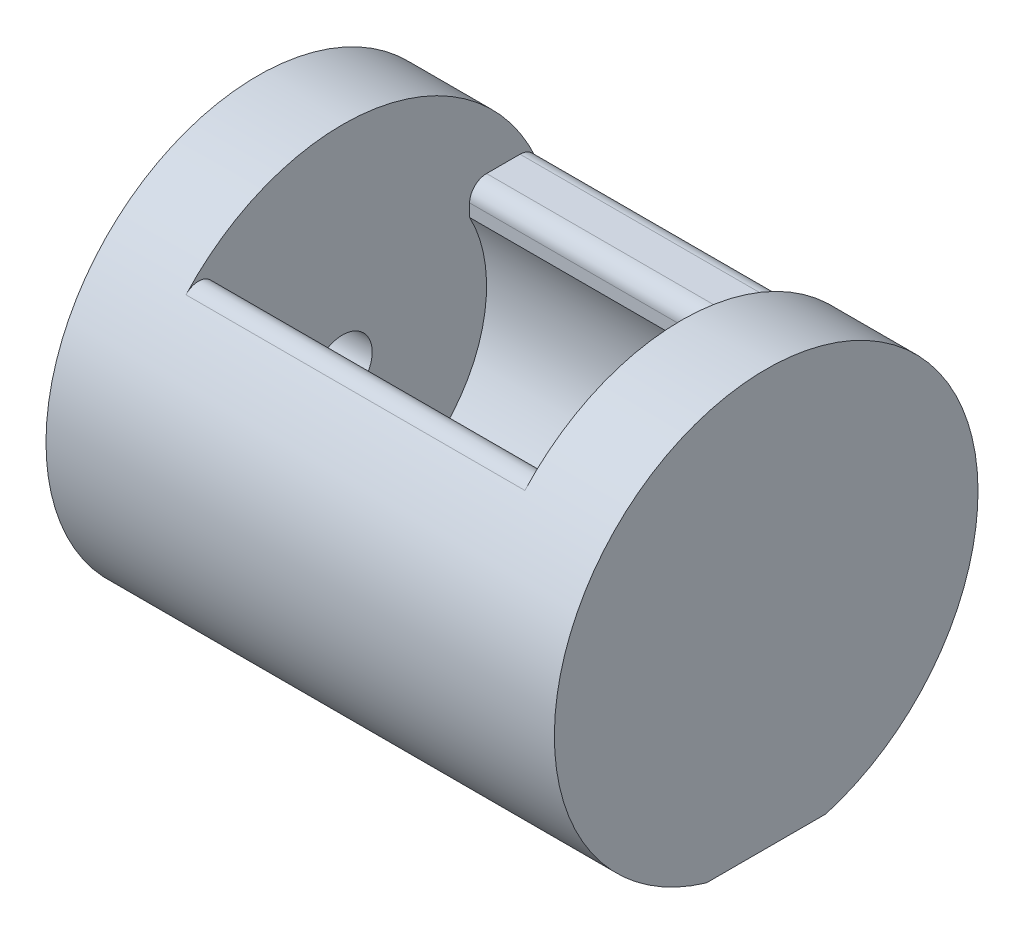
ISO-10303-21;
HEADER;
FILE_DESCRIPTION(('STEP AP214'),'2;1');
FILE_NAME('part.step','',(''),(''),'','','');
FILE_SCHEMA(('AUTOMOTIVE_DESIGN { 1 0 10303 214 1 1 1 1 }'));
ENDSEC;
DATA;
#1=APPLICATION_CONTEXT('core data for automotive mechanical design processes');
#2=APPLICATION_PROTOCOL_DEFINITION('international standard','automotive_design',2000,#1);
#3=PRODUCT_CONTEXT('',#1,'mechanical');
#4=PRODUCT('Part','Part','',(#3));
#5=PRODUCT_RELATED_PRODUCT_CATEGORY('part','',(#4));
#6=PRODUCT_DEFINITION_FORMATION('','',#4);
#7=PRODUCT_DEFINITION_CONTEXT('part definition',#1,'design');
#8=PRODUCT_DEFINITION('design','',#6,#7);
#9=PRODUCT_DEFINITION_SHAPE('','',#8);
#10=(LENGTH_UNIT() NAMED_UNIT(*) SI_UNIT(.MILLI.,.METRE.));
#11=(NAMED_UNIT(*) PLANE_ANGLE_UNIT() SI_UNIT($,.RADIAN.));
#12=(NAMED_UNIT(*) SI_UNIT($,.STERADIAN.) SOLID_ANGLE_UNIT());
#13=UNCERTAINTY_MEASURE_WITH_UNIT(LENGTH_MEASURE(1.E-05),#10,'distance_accuracy_value','');
#14=(GEOMETRIC_REPRESENTATION_CONTEXT(3) GLOBAL_UNCERTAINTY_ASSIGNED_CONTEXT((#13)) GLOBAL_UNIT_ASSIGNED_CONTEXT((#10,
#11,#12)) REPRESENTATION_CONTEXT('',''));
#15=CARTESIAN_POINT('',(0.,0.,0.));
#16=DIRECTION('',(0.,0.,1.));
#17=DIRECTION('',(1.,0.,0.));
#18=AXIS2_PLACEMENT_3D('',#15,#16,#17);
#19=CARTESIAN_POINT('',(20.,0.,0.));
#20=DIRECTION('',(-1.,0.,0.));
#21=DIRECTION('',(0.,0.,1.));
#22=AXIS2_PLACEMENT_3D('',#19,#20,#21);
#23=CYLINDRICAL_SURFACE('',#22,3.5);
#24=CARTESIAN_POINT('',(10.,0.,0.));
#25=DIRECTION('',(-1.,0.,0.));
#26=DIRECTION('',(0.,0.,1.));
#27=AXIS2_PLACEMENT_3D('',#24,#25,#26);
#28=CIRCLE('',#27,3.5);
#29=CARTESIAN_POINT('',(10.,0.,3.5));
#30=VERTEX_POINT('',#29);
#31=EDGE_CURVE('E195',#30,#30,#28,.F.);
#32=ORIENTED_EDGE('',*,*,#31,.T.);
#33=EDGE_LOOP('',(#32));
#34=FACE_BOUND('',#33,.T.);
#35=CARTESIAN_POINT('',(3.,0.,0.));
#36=DIRECTION('',(-1.,0.,0.));
#37=DIRECTION('',(0.,0.,1.));
#38=AXIS2_PLACEMENT_3D('',#35,#36,#37);
#39=CIRCLE('',#38,3.5);
#40=CARTESIAN_POINT('',(3.,0.,3.5));
#41=VERTEX_POINT('',#40);
#42=EDGE_CURVE('E200',#41,#41,#39,.T.);
#43=ORIENTED_EDGE('',*,*,#42,.T.);
#44=EDGE_LOOP('',(#43));
#45=FACE_BOUND('',#44,.T.);
#46=ADVANCED_FACE('F45',(#34,#45),#23,.F.);
#47=CARTESIAN_POINT('',(10.,30.,15.));
#48=DIRECTION('',(0.,0.,-1.));
#49=DIRECTION('',(-1.,0.,0.));
#50=AXIS2_PLACEMENT_3D('',#47,#48,#49);
#51=PLANE('',#50);
#52=DIRECTION('',(0.,-1.,0.));
#53=VECTOR('',#52,1.);
#54=CARTESIAN_POINT('',(10.,30.,15.));
#55=LINE('',#54,#53);
#56=CARTESIAN_POINT('',(10.,15.4919333848297,15.));
#57=VERTEX_POINT('',#56);
#58=CARTESIAN_POINT('',(10.,8.,15.));
#59=VERTEX_POINT('',#58);
#60=EDGE_CURVE('E171',#57,#59,#55,.T.);
#61=ORIENTED_EDGE('',*,*,#60,.F.);
#62=DIRECTION('',(1.,0.,0.));
#63=VECTOR('',#62,1.);
#64=CARTESIAN_POINT('',(50.,15.4919333848297,15.));
#65=LINE('',#64,#63);
#66=CARTESIAN_POINT('',(50.,15.4919333848297,15.));
#67=VERTEX_POINT('',#66);
#68=EDGE_CURVE('E183',#57,#67,#65,.T.);
#69=ORIENTED_EDGE('',*,*,#68,.T.);
#70=DIRECTION('',(0.,-1.,0.));
#71=VECTOR('',#70,1.);
#72=CARTESIAN_POINT('',(50.,30.,15.));
#73=LINE('',#72,#71);
#74=CARTESIAN_POINT('',(50.,8.,15.));
#75=VERTEX_POINT('',#74);
#76=EDGE_CURVE('E176',#67,#75,#73,.T.);
#77=ORIENTED_EDGE('',*,*,#76,.T.);
#78=DIRECTION('',(-1.,0.,0.));
#79=VECTOR('',#78,1.);
#80=CARTESIAN_POINT('',(50.,8.,15.));
#81=LINE('',#80,#79);
#82=EDGE_CURVE('E304',#75,#59,#81,.T.);
#83=ORIENTED_EDGE('',*,*,#82,.T.);
#84=EDGE_LOOP('',(#61,#69,#77,#83));
#85=FACE_BOUND('',#84,.T.);
#86=ADVANCED_FACE('F319',(#85),#51,.T.);
#87=CARTESIAN_POINT('',(10.,30.,-15.));
#88=DIRECTION('',(0.,0.,-1.));
#89=DIRECTION('',(-1.,0.,0.));
#90=AXIS2_PLACEMENT_3D('',#87,#88,#89);
#91=PLANE('',#90);
#92=DIRECTION('',(0.,-1.,0.));
#93=VECTOR('',#92,1.);
#94=CARTESIAN_POINT('',(50.,30.,-15.));
#95=LINE('',#94,#93);
#96=CARTESIAN_POINT('',(50.,9.49193338482967,-15.));
#97=VERTEX_POINT('',#96);
#98=CARTESIAN_POINT('',(50.,8.,-15.));
#99=VERTEX_POINT('',#98);
#100=EDGE_CURVE('E311',#97,#99,#95,.T.);
#101=ORIENTED_EDGE('',*,*,#100,.F.);
#102=DIRECTION('',(-1.,0.,0.));
#103=VECTOR('',#102,1.);
#104=CARTESIAN_POINT('',(10.,9.49193338482966,-15.));
#105=LINE('',#104,#103);
#106=CARTESIAN_POINT('',(10.,9.49193338482966,-15.));
#107=VERTEX_POINT('',#106);
#108=EDGE_CURVE('E157',#97,#107,#105,.T.);
#109=ORIENTED_EDGE('',*,*,#108,.T.);
#110=DIRECTION('',(0.,-1.,0.));
#111=VECTOR('',#110,1.);
#112=CARTESIAN_POINT('',(10.,30.,-15.));
#113=LINE('',#112,#111);
#114=CARTESIAN_POINT('',(10.,8.,-15.));
#115=VERTEX_POINT('',#114);
#116=EDGE_CURVE('E308',#107,#115,#113,.T.);
#117=ORIENTED_EDGE('',*,*,#116,.T.);
#118=DIRECTION('',(-1.,0.,0.));
#119=VECTOR('',#118,1.);
#120=CARTESIAN_POINT('',(50.,8.,-15.));
#121=LINE('',#120,#119);
#122=EDGE_CURVE('E300',#99,#115,#121,.T.);
#123=ORIENTED_EDGE('',*,*,#122,.F.);
#124=EDGE_LOOP('',(#101,#109,#117,#123));
#125=FACE_BOUND('',#124,.T.);
#126=ADVANCED_FACE('F329',(#125),#91,.F.);
#127=CARTESIAN_POINT('',(60.,0.,0.));
#128=DIRECTION('',(-1.,0.,0.));
#129=DIRECTION('',(0.,0.,1.));
#130=AXIS2_PLACEMENT_3D('',#127,#128,#129);
#131=CYLINDRICAL_SURFACE('',#130,25.);
#132=DIRECTION('',(-1.,0.,0.));
#133=VECTOR('',#132,1.);
#134=CARTESIAN_POINT('',(60.,10.317318896554,-22.7717573056365));
#135=LINE('',#134,#133);
#136=CARTESIAN_POINT('',(10.,10.317318896554,-22.7717573056365));
#137=VERTEX_POINT('',#136);
#138=CARTESIAN_POINT('',(50.,10.317318896554,-22.7717573056365));
#139=VERTEX_POINT('',#138);
#140=EDGE_CURVE('E214',#137,#139,#135,.F.);
#141=ORIENTED_EDGE('',*,*,#140,.T.);
#142=CARTESIAN_POINT('',(50.,0.,0.));
#143=DIRECTION('',(-1.,0.,0.));
#144=DIRECTION('',(0.,0.,1.));
#145=AXIS2_PLACEMENT_3D('',#142,#143,#144);
#146=CIRCLE('',#145,25.);
#147=CARTESIAN_POINT('',(50.,16.8390580269888,18.4782608695652));
#148=VERTEX_POINT('',#147);
#149=EDGE_CURVE('E61',#148,#139,#146,.T.);
#150=ORIENTED_EDGE('',*,*,#149,.F.);
#151=DIRECTION('',(-1.,0.,0.));
#152=VECTOR('',#151,1.);
#153=CARTESIAN_POINT('',(60.,16.8390580269888,18.4782608695652));
#154=LINE('',#153,#152);
#155=CARTESIAN_POINT('',(10.,16.8390580269888,18.4782608695652));
#156=VERTEX_POINT('',#155);
#157=EDGE_CURVE('E187',#148,#156,#154,.T.);
#158=ORIENTED_EDGE('',*,*,#157,.T.);
#159=CARTESIAN_POINT('',(10.,0.,0.));
#160=DIRECTION('',(-1.,0.,0.));
#161=DIRECTION('',(0.,0.,1.));
#162=AXIS2_PLACEMENT_3D('',#159,#160,#161);
#163=CIRCLE('',#162,25.);
#164=EDGE_CURVE('E69',#156,#137,#163,.T.);
#165=ORIENTED_EDGE('',*,*,#164,.T.);
#166=EDGE_LOOP('',(#141,#150,#158,#165));
#167=FACE_BOUND('',#166,.T.);
#168=CARTESIAN_POINT('',(60.,0.,0.));
#169=DIRECTION('',(1.,0.,0.));
#170=DIRECTION('',(0.,0.,-1.));
#171=AXIS2_PLACEMENT_3D('',#168,#169,#170);
#172=CIRCLE('',#171,25.);
#173=CARTESIAN_POINT('',(60.,-23.9862313483264,-7.04703524218254));
#174=VERTEX_POINT('',#173);
#175=CARTESIAN_POINT('',(60.,-23.9862313483264,7.04703524218254));
#176=VERTEX_POINT('',#175);
#177=EDGE_CURVE('E165',#174,#176,#172,.T.);
#178=ORIENTED_EDGE('',*,*,#177,.F.);
#179=DIRECTION('',(-1.,0.,0.));
#180=VECTOR('',#179,1.);
#181=CARTESIAN_POINT('',(60.,-23.9862313483264,-7.04703524218254));
#182=LINE('',#181,#180);
#183=CARTESIAN_POINT('',(0.,-23.9862313483264,-7.04703524218254));
#184=VERTEX_POINT('',#183);
#185=EDGE_CURVE('E149',#174,#184,#182,.T.);
#186=ORIENTED_EDGE('',*,*,#185,.T.);
#187=CARTESIAN_POINT('',(0.,0.,0.));
#188=DIRECTION('',(1.,0.,0.));
#189=DIRECTION('',(0.,0.,-1.));
#190=AXIS2_PLACEMENT_3D('',#187,#188,#189);
#191=CIRCLE('',#190,25.);
#192=CARTESIAN_POINT('',(0.,-23.9862313483264,7.04703524218254));
#193=VERTEX_POINT('',#192);
#194=EDGE_CURVE('E163',#184,#193,#191,.T.);
#195=ORIENTED_EDGE('',*,*,#194,.T.);
#196=DIRECTION('',(-1.,0.,0.));
#197=VECTOR('',#196,1.);
#198=CARTESIAN_POINT('',(60.,-23.9862313483264,7.04703524218254));
#199=LINE('',#198,#197);
#200=EDGE_CURVE('E152',#193,#176,#199,.F.);
#201=ORIENTED_EDGE('',*,*,#200,.T.);
#202=EDGE_LOOP('',(#178,#186,#195,#201));
#203=FACE_BOUND('',#202,.T.);
#204=ADVANCED_FACE('F162',(#167,#203),#131,.T.);
#205=CARTESIAN_POINT('',(60.,0.,0.));
#206=DIRECTION('',(1.,0.,0.));
#207=DIRECTION('',(0.,0.,-1.));
#208=AXIS2_PLACEMENT_3D('',#205,#206,#207);
#209=PLANE('',#208);
#210=DIRECTION('',(0.,0.,-1.));
#211=VECTOR('',#210,1.);
#212=CARTESIAN_POINT('',(60.,-23.9862313483264,19.61267349564));
#213=LINE('',#212,#211);
#214=EDGE_CURVE('E237',#176,#174,#213,.T.);
#215=ORIENTED_EDGE('',*,*,#214,.T.);
#216=ORIENTED_EDGE('',*,*,#177,.T.);
#217=EDGE_LOOP('',(#215,#216));
#218=FACE_BOUND('',#217,.T.);
#219=ADVANCED_FACE('F362',(#218),#209,.T.);
#220=CARTESIAN_POINT('',(0.,0.,0.));
#221=DIRECTION('',(1.,0.,0.));
#222=DIRECTION('',(0.,0.,-1.));
#223=AXIS2_PLACEMENT_3D('',#220,#221,#222);
#224=PLANE('',#223);
#225=DIRECTION('',(0.,-1.,0.));
#226=VECTOR('',#225,1.);
#227=CARTESIAN_POINT('',(0.,0.,-8.5));
#228=LINE('',#227,#226);
#229=CARTESIAN_POINT('',(0.,0.,-8.5));
#230=VERTEX_POINT('',#229);
#231=CARTESIAN_POINT('',(0.,-17.5,-8.5));
#232=VERTEX_POINT('',#231);
#233=EDGE_CURVE('E271',#230,#232,#228,.T.);
#234=ORIENTED_EDGE('',*,*,#233,.F.);
#235=CARTESIAN_POINT('',(0.,0.,0.));
#236=DIRECTION('',(-1.,0.,0.));
#237=DIRECTION('',(0.,0.,1.));
#238=AXIS2_PLACEMENT_3D('',#235,#236,#237);
#239=CIRCLE('',#238,8.5);
#240=CARTESIAN_POINT('',(0.,0.,8.5));
#241=VERTEX_POINT('',#240);
#242=EDGE_CURVE('E167',#241,#230,#239,.T.);
#243=ORIENTED_EDGE('',*,*,#242,.F.);
#244=DIRECTION('',(0.,1.,0.));
#245=VECTOR('',#244,1.);
#246=CARTESIAN_POINT('',(0.,-0.449954403464403,8.5));
#247=LINE('',#246,#245);
#248=CARTESIAN_POINT('',(0.,-17.5,8.5));
#249=VERTEX_POINT('',#248);
#250=EDGE_CURVE('E257',#249,#241,#247,.T.);
#251=ORIENTED_EDGE('',*,*,#250,.F.);
#252=DIRECTION('',(0.,0.,1.));
#253=VECTOR('',#252,1.);
#254=CARTESIAN_POINT('',(0.,-17.5,-8.5));
#255=LINE('',#254,#253);
#256=EDGE_CURVE('E275',#232,#249,#255,.T.);
#257=ORIENTED_EDGE('',*,*,#256,.F.);
#258=EDGE_LOOP('',(#234,#243,#251,#257));
#259=FACE_BOUND('',#258,.T.);
#260=ORIENTED_EDGE('',*,*,#194,.F.);
#261=DIRECTION('',(0.,0.,1.));
#262=VECTOR('',#261,1.);
#263=CARTESIAN_POINT('',(0.,-23.9862313483264,0.));
#264=LINE('',#263,#262);
#265=EDGE_CURVE('E146',#184,#193,#264,.T.);
#266=ORIENTED_EDGE('',*,*,#265,.T.);
#267=EDGE_LOOP('',(#260,#266));
#268=FACE_BOUND('',#267,.T.);
#269=ADVANCED_FACE('F169',(#259,#268),#224,.F.);
#270=CARTESIAN_POINT('',(50.,30.,15.));
#271=DIRECTION('',(-1.,0.,0.));
#272=DIRECTION('',(0.,0.,1.));
#273=AXIS2_PLACEMENT_3D('',#270,#271,#272);
#274=PLANE('',#273);
#275=ORIENTED_EDGE('',*,*,#149,.T.);
#276=CARTESIAN_POINT('',(50.,9.49193338482967,-20.9500167211856));
#277=DIRECTION('',(-1.,0.,0.));
#278=DIRECTION('',(0.,0.,1.));
#279=AXIS2_PLACEMENT_3D('',#276,#277,#278);
#280=CIRCLE('',#279,2.);
#281=CARTESIAN_POINT('',(50.,11.4919333848297,-20.9500167211856));
#282=VERTEX_POINT('',#281);
#283=EDGE_CURVE('E54',#139,#282,#280,.F.);
#284=ORIENTED_EDGE('',*,*,#283,.T.);
#285=DIRECTION('',(0.,0.,1.));
#286=VECTOR('',#285,1.);
#287=CARTESIAN_POINT('',(50.,11.4919333848297,-30.));
#288=LINE('',#287,#286);
#289=CARTESIAN_POINT('',(50.,11.4919333848297,-17.));
#290=VERTEX_POINT('',#289);
#291=EDGE_CURVE('E226',#282,#290,#288,.T.);
#292=ORIENTED_EDGE('',*,*,#291,.T.);
#293=CARTESIAN_POINT('',(50.,9.49193338482967,-17.));
#294=DIRECTION('',(-1.,0.,0.));
#295=DIRECTION('',(0.,0.,1.));
#296=AXIS2_PLACEMENT_3D('',#293,#294,#295);
#297=CIRCLE('',#296,2.);
#298=EDGE_CURVE('E220',#290,#97,#297,.F.);
#299=ORIENTED_EDGE('',*,*,#298,.T.);
#300=ORIENTED_EDGE('',*,*,#100,.T.);
#301=CARTESIAN_POINT('',(50.,0.,0.));
#302=DIRECTION('',(1.,0.,0.));
#303=DIRECTION('',(0.,0.,-1.));
#304=AXIS2_PLACEMENT_3D('',#301,#302,#303);
#305=CIRCLE('',#304,17.);
#306=EDGE_CURVE('E296',#75,#99,#305,.T.);
#307=ORIENTED_EDGE('',*,*,#306,.F.);
#308=ORIENTED_EDGE('',*,*,#76,.F.);
#309=CARTESIAN_POINT('',(50.,15.4919333848297,17.));
#310=DIRECTION('',(-1.,0.,0.));
#311=DIRECTION('',(0.,0.,1.));
#312=AXIS2_PLACEMENT_3D('',#309,#310,#311);
#313=CIRCLE('',#312,2.);
#314=EDGE_CURVE('E190',#67,#148,#313,.F.);
#315=ORIENTED_EDGE('',*,*,#314,.T.);
#316=EDGE_LOOP('',(#275,#284,#292,#299,#300,#307,#308,#315));
#317=FACE_BOUND('',#316,.T.);
#318=ADVANCED_FACE('F225',(#317),#274,.T.);
#319=CARTESIAN_POINT('',(10.,30.,0.));
#320=DIRECTION('',(-1.,0.,0.));
#321=DIRECTION('',(0.,0.,1.));
#322=AXIS2_PLACEMENT_3D('',#319,#320,#321);
#323=PLANE('',#322);
#324=ORIENTED_EDGE('',*,*,#116,.F.);
#325=CARTESIAN_POINT('',(10.,9.49193338482966,-17.));
#326=DIRECTION('',(-1.,0.,0.));
#327=DIRECTION('',(0.,0.,1.));
#328=AXIS2_PLACEMENT_3D('',#325,#326,#327);
#329=CIRCLE('',#328,2.);
#330=CARTESIAN_POINT('',(10.,11.4919333848297,-17.));
#331=VERTEX_POINT('',#330);
#332=EDGE_CURVE('E217',#107,#331,#329,.T.);
#333=ORIENTED_EDGE('',*,*,#332,.T.);
#334=DIRECTION('',(0.,0.,1.));
#335=VECTOR('',#334,1.);
#336=CARTESIAN_POINT('',(10.,11.4919333848297,-30.));
#337=LINE('',#336,#335);
#338=CARTESIAN_POINT('',(10.,11.4919333848297,-20.9500167211856));
#339=VERTEX_POINT('',#338);
#340=EDGE_CURVE('E238',#339,#331,#337,.T.);
#341=ORIENTED_EDGE('',*,*,#340,.F.);
#342=CARTESIAN_POINT('',(10.,9.49193338482967,-20.9500167211856));
#343=DIRECTION('',(-1.,0.,0.));
#344=DIRECTION('',(0.,0.,1.));
#345=AXIS2_PLACEMENT_3D('',#342,#343,#344);
#346=CIRCLE('',#345,2.);
#347=EDGE_CURVE('E11',#339,#137,#346,.T.);
#348=ORIENTED_EDGE('',*,*,#347,.T.);
#349=ORIENTED_EDGE('',*,*,#164,.F.);
#350=CARTESIAN_POINT('',(10.,15.4919333848297,17.));
#351=DIRECTION('',(-1.,0.,0.));
#352=DIRECTION('',(0.,0.,1.));
#353=AXIS2_PLACEMENT_3D('',#350,#351,#352);
#354=CIRCLE('',#353,2.);
#355=EDGE_CURVE('E158',#156,#57,#354,.T.);
#356=ORIENTED_EDGE('',*,*,#355,.T.);
#357=ORIENTED_EDGE('',*,*,#60,.T.);
#358=CARTESIAN_POINT('',(10.,0.,0.));
#359=DIRECTION('',(1.,0.,0.));
#360=DIRECTION('',(0.,0.,-1.));
#361=AXIS2_PLACEMENT_3D('',#358,#359,#360);
#362=CIRCLE('',#361,17.);
#363=EDGE_CURVE('E199',#59,#115,#362,.T.);
#364=ORIENTED_EDGE('',*,*,#363,.T.);
#365=EDGE_LOOP('',(#324,#333,#341,#348,#349,#356,#357,#364));
#366=FACE_BOUND('',#365,.T.);
#367=ORIENTED_EDGE('',*,*,#31,.F.);
#368=EDGE_LOOP('',(#367));
#369=FACE_BOUND('',#368,.T.);
#370=ADVANCED_FACE('F243',(#366,#369),#323,.F.);
#371=CARTESIAN_POINT('',(50.,0.,0.));
#372=DIRECTION('',(-1.,0.,0.));
#373=DIRECTION('',(0.,0.,1.));
#374=AXIS2_PLACEMENT_3D('',#371,#372,#373);
#375=CYLINDRICAL_SURFACE('',#374,17.);
#376=ORIENTED_EDGE('',*,*,#306,.T.);
#377=ORIENTED_EDGE('',*,*,#122,.T.);
#378=ORIENTED_EDGE('',*,*,#363,.F.);
#379=ORIENTED_EDGE('',*,*,#82,.F.);
#380=EDGE_LOOP('',(#376,#377,#378,#379));
#381=FACE_BOUND('',#380,.T.);
#382=ADVANCED_FACE('F324',(#381),#375,.F.);
#383=CARTESIAN_POINT('',(60.,15.4919333848297,17.));
#384=DIRECTION('',(-1.,0.,0.));
#385=DIRECTION('',(0.,0.,1.));
#386=AXIS2_PLACEMENT_3D('',#383,#384,#385);
#387=CYLINDRICAL_SURFACE('',#386,2.);
#388=ORIENTED_EDGE('',*,*,#355,.F.);
#389=ORIENTED_EDGE('',*,*,#157,.F.);
#390=ORIENTED_EDGE('',*,*,#314,.F.);
#391=ORIENTED_EDGE('',*,*,#68,.F.);
#392=EDGE_LOOP('',(#388,#389,#390,#391));
#393=FACE_BOUND('',#392,.T.);
#394=ADVANCED_FACE('F355',(#393),#387,.T.);
#395=CARTESIAN_POINT('',(3.,0.,0.));
#396=DIRECTION('',(-1.,0.,0.));
#397=DIRECTION('',(0.,0.,1.));
#398=AXIS2_PLACEMENT_3D('',#395,#396,#397);
#399=CYLINDRICAL_SURFACE('',#398,8.5);
#400=ORIENTED_EDGE('',*,*,#242,.T.);
#401=DIRECTION('',(-1.,0.,0.));
#402=VECTOR('',#401,1.);
#403=CARTESIAN_POINT('',(3.,0.,-8.5));
#404=LINE('',#403,#402);
#405=CARTESIAN_POINT('',(3.,0.,-8.5));
#406=VERTEX_POINT('',#405);
#407=EDGE_CURVE('E268',#406,#230,#404,.T.);
#408=ORIENTED_EDGE('',*,*,#407,.F.);
#409=CARTESIAN_POINT('',(3.,0.,0.));
#410=DIRECTION('',(-1.,0.,0.));
#411=DIRECTION('',(0.,0.,1.));
#412=AXIS2_PLACEMENT_3D('',#409,#410,#411);
#413=CIRCLE('',#412,8.5);
#414=CARTESIAN_POINT('',(3.,0.,8.5));
#415=VERTEX_POINT('',#414);
#416=EDGE_CURVE('E252',#415,#406,#413,.T.);
#417=ORIENTED_EDGE('',*,*,#416,.F.);
#418=DIRECTION('',(-1.,0.,0.));
#419=VECTOR('',#418,1.);
#420=CARTESIAN_POINT('',(3.,0.,8.5));
#421=LINE('',#420,#419);
#422=EDGE_CURVE('E203',#415,#241,#421,.T.);
#423=ORIENTED_EDGE('',*,*,#422,.T.);
#424=EDGE_LOOP('',(#400,#408,#417,#423));
#425=FACE_BOUND('',#424,.T.);
#426=ADVANCED_FACE('F351',(#425),#399,.F.);
#427=CARTESIAN_POINT('',(3.,-0.449954403464403,8.5));
#428=DIRECTION('',(0.,0.,1.));
#429=DIRECTION('',(1.,0.,0.));
#430=AXIS2_PLACEMENT_3D('',#427,#428,#429);
#431=PLANE('',#430);
#432=ORIENTED_EDGE('',*,*,#250,.T.);
#433=ORIENTED_EDGE('',*,*,#422,.F.);
#434=DIRECTION('',(0.,1.,0.));
#435=VECTOR('',#434,1.);
#436=CARTESIAN_POINT('',(3.,-17.5,8.5));
#437=LINE('',#436,#435);
#438=CARTESIAN_POINT('',(3.,-17.5,8.5));
#439=VERTEX_POINT('',#438);
#440=EDGE_CURVE('E265',#439,#415,#437,.T.);
#441=ORIENTED_EDGE('',*,*,#440,.F.);
#442=DIRECTION('',(-1.,0.,0.));
#443=VECTOR('',#442,1.);
#444=CARTESIAN_POINT('',(3.,-17.5,8.5));
#445=LINE('',#444,#443);
#446=EDGE_CURVE('E284',#439,#249,#445,.T.);
#447=ORIENTED_EDGE('',*,*,#446,.T.);
#448=EDGE_LOOP('',(#432,#433,#441,#447));
#449=FACE_BOUND('',#448,.T.);
#450=ADVANCED_FACE('F373',(#449),#431,.F.);
#451=CARTESIAN_POINT('',(3.,-17.5,-8.5));
#452=DIRECTION('',(0.,-1.,0.));
#453=DIRECTION('',(0.,0.,-1.));
#454=AXIS2_PLACEMENT_3D('',#451,#452,#453);
#455=PLANE('',#454);
#456=ORIENTED_EDGE('',*,*,#256,.T.);
#457=ORIENTED_EDGE('',*,*,#446,.F.);
#458=DIRECTION('',(0.,0.,1.));
#459=VECTOR('',#458,1.);
#460=CARTESIAN_POINT('',(3.,-17.5,-8.5));
#461=LINE('',#460,#459);
#462=CARTESIAN_POINT('',(3.,-17.5,-8.5));
#463=VERTEX_POINT('',#462);
#464=EDGE_CURVE('E261',#463,#439,#461,.T.);
#465=ORIENTED_EDGE('',*,*,#464,.F.);
#466=DIRECTION('',(-1.,0.,0.));
#467=VECTOR('',#466,1.);
#468=CARTESIAN_POINT('',(3.,-17.5,-8.5));
#469=LINE('',#468,#467);
#470=EDGE_CURVE('E287',#463,#232,#469,.T.);
#471=ORIENTED_EDGE('',*,*,#470,.T.);
#472=EDGE_LOOP('',(#456,#457,#465,#471));
#473=FACE_BOUND('',#472,.T.);
#474=ADVANCED_FACE('F380',(#473),#455,.F.);
#475=CARTESIAN_POINT('',(3.,0.,-8.5));
#476=DIRECTION('',(0.,0.,-1.));
#477=DIRECTION('',(-1.,0.,0.));
#478=AXIS2_PLACEMENT_3D('',#475,#476,#477);
#479=PLANE('',#478);
#480=ORIENTED_EDGE('',*,*,#233,.T.);
#481=ORIENTED_EDGE('',*,*,#470,.F.);
#482=DIRECTION('',(0.,-1.,0.));
#483=VECTOR('',#482,1.);
#484=CARTESIAN_POINT('',(3.,0.,-8.5));
#485=LINE('',#484,#483);
#486=EDGE_CURVE('E256',#406,#463,#485,.T.);
#487=ORIENTED_EDGE('',*,*,#486,.F.);
#488=ORIENTED_EDGE('',*,*,#407,.T.);
#489=EDGE_LOOP('',(#480,#481,#487,#488));
#490=FACE_BOUND('',#489,.T.);
#491=ADVANCED_FACE('F390',(#490),#479,.F.);
#492=CARTESIAN_POINT('',(3.,0.,0.));
#493=DIRECTION('',(-1.,0.,0.));
#494=DIRECTION('',(0.,0.,1.));
#495=AXIS2_PLACEMENT_3D('',#492,#493,#494);
#496=PLANE('',#495);
#497=ORIENTED_EDGE('',*,*,#42,.F.);
#498=EDGE_LOOP('',(#497));
#499=FACE_BOUND('',#498,.T.);
#500=ORIENTED_EDGE('',*,*,#416,.T.);
#501=ORIENTED_EDGE('',*,*,#486,.T.);
#502=ORIENTED_EDGE('',*,*,#464,.T.);
#503=ORIENTED_EDGE('',*,*,#440,.T.);
#504=EDGE_LOOP('',(#500,#501,#502,#503));
#505=FACE_BOUND('',#504,.T.);
#506=ADVANCED_FACE('F396',(#499,#505),#496,.T.);
#507=CARTESIAN_POINT('',(60.,-23.9862313483264,19.61267349564));
#508=DIRECTION('',(0.,1.,0.));
#509=DIRECTION('',(0.,0.,1.));
#510=AXIS2_PLACEMENT_3D('',#507,#508,#509);
#511=PLANE('',#510);
#512=ORIENTED_EDGE('',*,*,#214,.F.);
#513=ORIENTED_EDGE('',*,*,#200,.F.);
#514=ORIENTED_EDGE('',*,*,#265,.F.);
#515=ORIENTED_EDGE('',*,*,#185,.F.);
#516=EDGE_LOOP('',(#512,#513,#514,#515));
#517=FACE_BOUND('',#516,.T.);
#518=ADVANCED_FACE('F148',(#517),#511,.F.);
#519=CARTESIAN_POINT('',(50.,11.4919333848297,-30.));
#520=DIRECTION('',(0.,-1.,0.));
#521=DIRECTION('',(1.,0.,0.));
#522=AXIS2_PLACEMENT_3D('',#519,#520,#521);
#523=PLANE('',#522);
#524=ORIENTED_EDGE('',*,*,#340,.T.);
#525=DIRECTION('',(-1.,0.,0.));
#526=VECTOR('',#525,1.);
#527=CARTESIAN_POINT('',(50.,11.4919333848297,-17.));
#528=LINE('',#527,#526);
#529=EDGE_CURVE('E211',#331,#290,#528,.F.);
#530=ORIENTED_EDGE('',*,*,#529,.T.);
#531=ORIENTED_EDGE('',*,*,#291,.F.);
#532=DIRECTION('',(-1.,0.,0.));
#533=VECTOR('',#532,1.);
#534=CARTESIAN_POINT('',(50.,11.4919333848297,-20.9500167211856));
#535=LINE('',#534,#533);
#536=EDGE_CURVE('E208',#282,#339,#535,.T.);
#537=ORIENTED_EDGE('',*,*,#536,.T.);
#538=EDGE_LOOP('',(#524,#530,#531,#537));
#539=FACE_BOUND('',#538,.T.);
#540=ADVANCED_FACE('F233',(#539),#523,.F.);
#541=CARTESIAN_POINT('',(10.,9.49193338482966,-17.));
#542=DIRECTION('',(-1.,0.,0.));
#543=DIRECTION('',(0.,-1.,0.));
#544=AXIS2_PLACEMENT_3D('',#541,#542,#543);
#545=CYLINDRICAL_SURFACE('',#544,2.);
#546=ORIENTED_EDGE('',*,*,#298,.F.);
#547=ORIENTED_EDGE('',*,*,#529,.F.);
#548=ORIENTED_EDGE('',*,*,#332,.F.);
#549=ORIENTED_EDGE('',*,*,#108,.F.);
#550=EDGE_LOOP('',(#546,#547,#548,#549));
#551=FACE_BOUND('',#550,.T.);
#552=ADVANCED_FACE('F331',(#551),#545,.T.);
#553=CARTESIAN_POINT('',(60.,9.49193338482967,-20.9500167211856));
#554=DIRECTION('',(-1.,0.,0.));
#555=DIRECTION('',(0.,0.,1.));
#556=AXIS2_PLACEMENT_3D('',#553,#554,#555);
#557=CYLINDRICAL_SURFACE('',#556,2.);
#558=ORIENTED_EDGE('',*,*,#347,.F.);
#559=ORIENTED_EDGE('',*,*,#536,.F.);
#560=ORIENTED_EDGE('',*,*,#283,.F.);
#561=ORIENTED_EDGE('',*,*,#140,.F.);
#562=EDGE_LOOP('',(#558,#559,#560,#561));
#563=FACE_BOUND('',#562,.T.);
#564=ADVANCED_FACE('F47',(#563),#557,.T.);
#565=CLOSED_SHELL('',(#46,#86,#126,#204,#219,#269,#318,#370,#382,#394,#426,#450,#474,#491,#506,
#518,#540,#552,#564));
#566=MANIFOLD_SOLID_BREP('B2',#565);
#567=ADVANCED_BREP_SHAPE_REPRESENTATION('',(#18,#566),#14);
#568=SHAPE_DEFINITION_REPRESENTATION(#9,#567);
ENDSEC;
END-ISO-10303-21;
